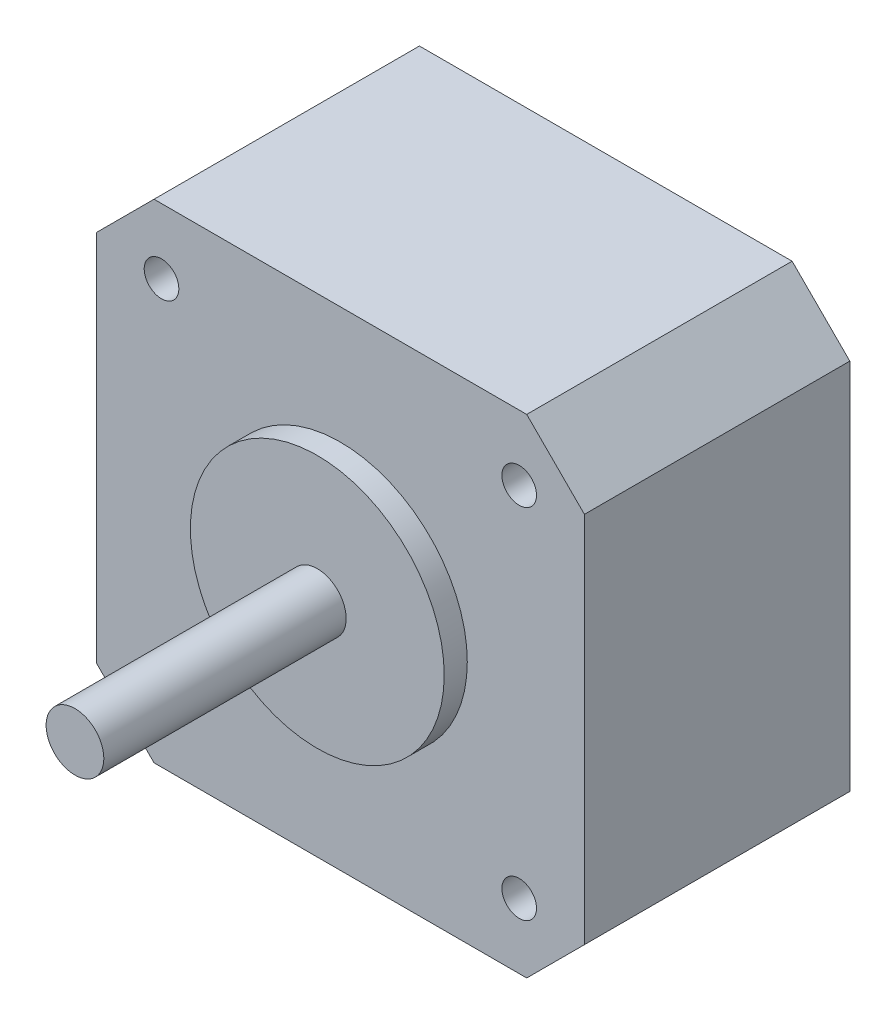
ISO-10303-21;
HEADER;
FILE_DESCRIPTION(('STEP AP214'),'2;1');
FILE_NAME('part.step','',(''),(''),'','','');
FILE_SCHEMA(('AUTOMOTIVE_DESIGN { 1 0 10303 214 1 1 1 1 }'));
ENDSEC;
DATA;
#1=APPLICATION_CONTEXT('core data for automotive mechanical design processes');
#2=APPLICATION_PROTOCOL_DEFINITION('international standard','automotive_design',2000,#1);
#3=PRODUCT_CONTEXT('',#1,'mechanical');
#4=PRODUCT('Part','Part','',(#3));
#5=PRODUCT_RELATED_PRODUCT_CATEGORY('part','',(#4));
#6=PRODUCT_DEFINITION_FORMATION('','',#4);
#7=PRODUCT_DEFINITION_CONTEXT('part definition',#1,'design');
#8=PRODUCT_DEFINITION('design','',#6,#7);
#9=PRODUCT_DEFINITION_SHAPE('','',#8);
#10=(LENGTH_UNIT() NAMED_UNIT(*) SI_UNIT(.MILLI.,.METRE.));
#11=(NAMED_UNIT(*) PLANE_ANGLE_UNIT() SI_UNIT($,.RADIAN.));
#12=(NAMED_UNIT(*) SI_UNIT($,.STERADIAN.) SOLID_ANGLE_UNIT());
#13=UNCERTAINTY_MEASURE_WITH_UNIT(LENGTH_MEASURE(1.E-05),#10,'distance_accuracy_value','');
#14=(GEOMETRIC_REPRESENTATION_CONTEXT(3) GLOBAL_UNCERTAINTY_ASSIGNED_CONTEXT((#13)) GLOBAL_UNIT_ASSIGNED_CONTEXT((#10,
#11,#12)) REPRESENTATION_CONTEXT('',''));
#15=CARTESIAN_POINT('',(0.,0.,0.));
#16=DIRECTION('',(0.,0.,1.));
#17=DIRECTION('',(1.,0.,0.));
#18=AXIS2_PLACEMENT_3D('',#15,#16,#17);
#19=CARTESIAN_POINT('',(21.15,21.15,-23.));
#20=DIRECTION('',(1.,0.,0.));
#21=DIRECTION('',(0.,0.,-1.));
#22=AXIS2_PLACEMENT_3D('',#19,#20,#21);
#23=PLANE('',#22);
#24=DIRECTION('',(0.,1.,0.));
#25=VECTOR('',#24,1.);
#26=CARTESIAN_POINT('',(21.15,21.15,0.));
#27=LINE('',#26,#25);
#28=CARTESIAN_POINT('',(21.15,-16.15,0.));
#29=VERTEX_POINT('',#28);
#30=CARTESIAN_POINT('',(21.15,16.15,0.));
#31=VERTEX_POINT('',#30);
#32=EDGE_CURVE('E210',#29,#31,#27,.T.);
#33=ORIENTED_EDGE('',*,*,#32,.F.);
#34=DIRECTION('',(0.,0.,-1.));
#35=VECTOR('',#34,1.);
#36=CARTESIAN_POINT('',(21.15,-16.15,-23.));
#37=LINE('',#36,#35);
#38=CARTESIAN_POINT('',(21.15,-16.15,-23.));
#39=VERTEX_POINT('',#38);
#40=EDGE_CURVE('E285',#29,#39,#37,.T.);
#41=ORIENTED_EDGE('',*,*,#40,.T.);
#42=DIRECTION('',(0.,1.,0.));
#43=VECTOR('',#42,1.);
#44=CARTESIAN_POINT('',(21.15,21.15,-23.));
#45=LINE('',#44,#43);
#46=CARTESIAN_POINT('',(21.15,16.15,-23.));
#47=VERTEX_POINT('',#46);
#48=EDGE_CURVE('E214',#39,#47,#45,.T.);
#49=ORIENTED_EDGE('',*,*,#48,.T.);
#50=DIRECTION('',(0.,0.,1.));
#51=VECTOR('',#50,1.);
#52=CARTESIAN_POINT('',(21.15,16.15,-23.));
#53=LINE('',#52,#51);
#54=EDGE_CURVE('E281',#47,#31,#53,.T.);
#55=ORIENTED_EDGE('',*,*,#54,.T.);
#56=EDGE_LOOP('',(#33,#41,#49,#55));
#57=FACE_BOUND('',#56,.T.);
#58=ADVANCED_FACE('F41',(#57),#23,.T.);
#59=CARTESIAN_POINT('',(-21.15,-21.15,-23.));
#60=DIRECTION('',(0.,-1.,0.));
#61=DIRECTION('',(0.,0.,-1.));
#62=AXIS2_PLACEMENT_3D('',#59,#60,#61);
#63=PLANE('',#62);
#64=DIRECTION('',(0.,0.,-1.));
#65=VECTOR('',#64,1.);
#66=CARTESIAN_POINT('',(-8.,-21.15,-13.4));
#67=LINE('',#66,#65);
#68=CARTESIAN_POINT('',(-8.,-21.15,-13.4));
#69=VERTEX_POINT('',#68);
#70=CARTESIAN_POINT('',(-8.,-21.15,-23.));
#71=VERTEX_POINT('',#70);
#72=EDGE_CURVE('E152',#69,#71,#67,.T.);
#73=ORIENTED_EDGE('',*,*,#72,.F.);
#74=DIRECTION('',(1.,0.,0.));
#75=VECTOR('',#74,1.);
#76=CARTESIAN_POINT('',(8.,-21.15,-13.4));
#77=LINE('',#76,#75);
#78=CARTESIAN_POINT('',(8.,-21.15,-13.4));
#79=VERTEX_POINT('',#78);
#80=EDGE_CURVE('E137',#69,#79,#77,.T.);
#81=ORIENTED_EDGE('',*,*,#80,.T.);
#82=DIRECTION('',(0.,0.,-1.));
#83=VECTOR('',#82,1.);
#84=CARTESIAN_POINT('',(8.,-21.15,-13.4));
#85=LINE('',#84,#83);
#86=CARTESIAN_POINT('',(7.99999999999999,-21.15,-23.));
#87=VERTEX_POINT('',#86);
#88=EDGE_CURVE('E163',#79,#87,#85,.T.);
#89=ORIENTED_EDGE('',*,*,#88,.T.);
#90=DIRECTION('',(1.,0.,0.));
#91=VECTOR('',#90,1.);
#92=CARTESIAN_POINT('',(-21.15,-21.15,-23.));
#93=LINE('',#92,#91);
#94=CARTESIAN_POINT('',(16.15,-21.15,-23.));
#95=VERTEX_POINT('',#94);
#96=EDGE_CURVE('E226',#87,#95,#93,.T.);
#97=ORIENTED_EDGE('',*,*,#96,.T.);
#98=DIRECTION('',(0.,0.,1.));
#99=VECTOR('',#98,1.);
#100=CARTESIAN_POINT('',(16.15,-21.15,-23.));
#101=LINE('',#100,#99);
#102=CARTESIAN_POINT('',(16.15,-21.15,0.));
#103=VERTEX_POINT('',#102);
#104=EDGE_CURVE('E262',#95,#103,#101,.T.);
#105=ORIENTED_EDGE('',*,*,#104,.T.);
#106=DIRECTION('',(1.,0.,0.));
#107=VECTOR('',#106,1.);
#108=CARTESIAN_POINT('',(-21.15,-21.15,0.));
#109=LINE('',#108,#107);
#110=CARTESIAN_POINT('',(-16.15,-21.15,0.));
#111=VERTEX_POINT('',#110);
#112=EDGE_CURVE('E219',#111,#103,#109,.T.);
#113=ORIENTED_EDGE('',*,*,#112,.F.);
#114=DIRECTION('',(0.,0.,-1.));
#115=VECTOR('',#114,1.);
#116=CARTESIAN_POINT('',(-16.15,-21.15,-23.));
#117=LINE('',#116,#115);
#118=CARTESIAN_POINT('',(-16.15,-21.15,-23.));
#119=VERTEX_POINT('',#118);
#120=EDGE_CURVE('E266',#111,#119,#117,.T.);
#121=ORIENTED_EDGE('',*,*,#120,.T.);
#122=EDGE_CURVE('E161',#119,#71,#93,.T.);
#123=ORIENTED_EDGE('',*,*,#122,.T.);
#124=EDGE_LOOP('',(#73,#81,#89,#97,#105,#113,#121,#123));
#125=FACE_BOUND('',#124,.T.);
#126=ADVANCED_FACE('F159',(#125),#63,.T.);
#127=CARTESIAN_POINT('',(-21.15,21.15,-23.));
#128=DIRECTION('',(-1.,0.,0.));
#129=DIRECTION('',(0.,-1.,0.));
#130=AXIS2_PLACEMENT_3D('',#127,#128,#129);
#131=PLANE('',#130);
#132=DIRECTION('',(0.,-1.,0.));
#133=VECTOR('',#132,1.);
#134=CARTESIAN_POINT('',(-21.15,21.15,-23.));
#135=LINE('',#134,#133);
#136=CARTESIAN_POINT('',(-21.15,16.15,-23.));
#137=VERTEX_POINT('',#136);
#138=CARTESIAN_POINT('',(-21.15,-16.15,-23.));
#139=VERTEX_POINT('',#138);
#140=EDGE_CURVE('E222',#137,#139,#135,.T.);
#141=ORIENTED_EDGE('',*,*,#140,.T.);
#142=DIRECTION('',(0.,0.,1.));
#143=VECTOR('',#142,1.);
#144=CARTESIAN_POINT('',(-21.15,-16.15,-23.));
#145=LINE('',#144,#143);
#146=CARTESIAN_POINT('',(-21.15,-16.15,0.));
#147=VERTEX_POINT('',#146);
#148=EDGE_CURVE('E246',#139,#147,#145,.T.);
#149=ORIENTED_EDGE('',*,*,#148,.T.);
#150=DIRECTION('',(0.,-1.,0.));
#151=VECTOR('',#150,1.);
#152=CARTESIAN_POINT('',(-21.15,21.15,0.));
#153=LINE('',#152,#151);
#154=CARTESIAN_POINT('',(-21.15,16.15,0.));
#155=VERTEX_POINT('',#154);
#156=EDGE_CURVE('E237',#155,#147,#153,.T.);
#157=ORIENTED_EDGE('',*,*,#156,.F.);
#158=DIRECTION('',(0.,0.,-1.));
#159=VECTOR('',#158,1.);
#160=CARTESIAN_POINT('',(-21.15,16.15,-23.));
#161=LINE('',#160,#159);
#162=EDGE_CURVE('E229',#155,#137,#161,.T.);
#163=ORIENTED_EDGE('',*,*,#162,.T.);
#164=EDGE_LOOP('',(#141,#149,#157,#163));
#165=FACE_BOUND('',#164,.T.);
#166=ADVANCED_FACE('F341',(#165),#131,.T.);
#167=CARTESIAN_POINT('',(-21.15,21.15,-23.));
#168=DIRECTION('',(0.,1.,0.));
#169=DIRECTION('',(0.,0.,1.));
#170=AXIS2_PLACEMENT_3D('',#167,#168,#169);
#171=PLANE('',#170);
#172=DIRECTION('',(-1.,0.,0.));
#173=VECTOR('',#172,1.);
#174=CARTESIAN_POINT('',(-21.15,21.15,0.));
#175=LINE('',#174,#173);
#176=CARTESIAN_POINT('',(16.15,21.15,0.));
#177=VERTEX_POINT('',#176);
#178=CARTESIAN_POINT('',(-16.15,21.15,0.));
#179=VERTEX_POINT('',#178);
#180=EDGE_CURVE('E233',#177,#179,#175,.T.);
#181=ORIENTED_EDGE('',*,*,#180,.F.);
#182=DIRECTION('',(0.,0.,-1.));
#183=VECTOR('',#182,1.);
#184=CARTESIAN_POINT('',(16.15,21.15,-23.));
#185=LINE('',#184,#183);
#186=CARTESIAN_POINT('',(16.15,21.15,-23.));
#187=VERTEX_POINT('',#186);
#188=EDGE_CURVE('E52',#177,#187,#185,.T.);
#189=ORIENTED_EDGE('',*,*,#188,.T.);
#190=DIRECTION('',(-1.,0.,0.));
#191=VECTOR('',#190,1.);
#192=CARTESIAN_POINT('',(-21.15,21.15,-23.));
#193=LINE('',#192,#191);
#194=CARTESIAN_POINT('',(-16.15,21.15,-23.));
#195=VERTEX_POINT('',#194);
#196=EDGE_CURVE('E218',#187,#195,#193,.T.);
#197=ORIENTED_EDGE('',*,*,#196,.T.);
#198=DIRECTION('',(0.,0.,1.));
#199=VECTOR('',#198,1.);
#200=CARTESIAN_POINT('',(-16.15,21.15,-23.));
#201=LINE('',#200,#199);
#202=EDGE_CURVE('E288',#195,#179,#201,.T.);
#203=ORIENTED_EDGE('',*,*,#202,.T.);
#204=EDGE_LOOP('',(#181,#189,#197,#203));
#205=FACE_BOUND('',#204,.T.);
#206=ADVANCED_FACE('F295',(#205),#171,.T.);
#207=CARTESIAN_POINT('',(0.,0.,-23.));
#208=DIRECTION('',(0.,0.,1.));
#209=DIRECTION('',(1.,0.,0.));
#210=AXIS2_PLACEMENT_3D('',#207,#208,#209);
#211=PLANE('',#210);
#212=ORIENTED_EDGE('',*,*,#122,.F.);
#213=DIRECTION('',(0.707106781186549,-0.707106781186547,0.));
#214=VECTOR('',#213,1.);
#215=CARTESIAN_POINT('',(-21.15,-16.15,-23.));
#216=LINE('',#215,#214);
#217=EDGE_CURVE('E278',#119,#139,#216,.F.);
#218=ORIENTED_EDGE('',*,*,#217,.T.);
#219=ORIENTED_EDGE('',*,*,#140,.F.);
#220=DIRECTION('',(-0.707106781186547,-0.707106781186549,0.));
#221=VECTOR('',#220,1.);
#222=CARTESIAN_POINT('',(-16.15,21.15,-23.));
#223=LINE('',#222,#221);
#224=EDGE_CURVE('E68',#137,#195,#223,.F.);
#225=ORIENTED_EDGE('',*,*,#224,.T.);
#226=ORIENTED_EDGE('',*,*,#196,.F.);
#227=DIRECTION('',(-0.707106781186549,0.707106781186547,0.));
#228=VECTOR('',#227,1.);
#229=CARTESIAN_POINT('',(21.15,16.15,-23.));
#230=LINE('',#229,#228);
#231=EDGE_CURVE('E271',#187,#47,#230,.F.);
#232=ORIENTED_EDGE('',*,*,#231,.T.);
#233=ORIENTED_EDGE('',*,*,#48,.F.);
#234=DIRECTION('',(0.707106781186547,0.707106781186549,0.));
#235=VECTOR('',#234,1.);
#236=CARTESIAN_POINT('',(16.15,-21.15,-23.));
#237=LINE('',#236,#235);
#238=EDGE_CURVE('E274',#39,#95,#237,.F.);
#239=ORIENTED_EDGE('',*,*,#238,.T.);
#240=ORIENTED_EDGE('',*,*,#96,.F.);
#241=DIRECTION('',(0.,-1.,0.));
#242=VECTOR('',#241,1.);
#243=CARTESIAN_POINT('',(8.,-28.15,-23.));
#244=LINE('',#243,#242);
#245=CARTESIAN_POINT('',(8.,-28.15,-23.));
#246=VERTEX_POINT('',#245);
#247=EDGE_CURVE('E60',#87,#246,#244,.T.);
#248=ORIENTED_EDGE('',*,*,#247,.T.);
#249=DIRECTION('',(-1.,0.,0.));
#250=VECTOR('',#249,1.);
#251=CARTESIAN_POINT('',(8.,-28.15,-23.));
#252=LINE('',#251,#250);
#253=CARTESIAN_POINT('',(-8.,-28.15,-23.));
#254=VERTEX_POINT('',#253);
#255=EDGE_CURVE('E156',#246,#254,#252,.T.);
#256=ORIENTED_EDGE('',*,*,#255,.T.);
#257=DIRECTION('',(0.,1.,0.));
#258=VECTOR('',#257,1.);
#259=CARTESIAN_POINT('',(-8.,-28.15,-23.));
#260=LINE('',#259,#258);
#261=EDGE_CURVE('E327',#254,#71,#260,.T.);
#262=ORIENTED_EDGE('',*,*,#261,.T.);
#263=EDGE_LOOP('',(#212,#218,#219,#225,#226,#232,#233,#239,#240,#248,#256,#262));
#264=FACE_BOUND('',#263,.T.);
#265=ADVANCED_FACE('F299',(#264),#211,.F.);
#266=CARTESIAN_POINT('',(0.,0.,0.));
#267=DIRECTION('',(0.,0.,1.));
#268=DIRECTION('',(1.,0.,0.));
#269=AXIS2_PLACEMENT_3D('',#266,#267,#268);
#270=PLANE('',#269);
#271=CARTESIAN_POINT('',(0.,0.,0.));
#272=DIRECTION('',(0.,0.,1.));
#273=DIRECTION('',(1.,0.,0.));
#274=AXIS2_PLACEMENT_3D('',#271,#272,#273);
#275=CIRCLE('',#274,11.);
#276=CARTESIAN_POINT('',(11.,0.,0.));
#277=VERTEX_POINT('',#276);
#278=EDGE_CURVE('E11',#277,#277,#275,.T.);
#279=ORIENTED_EDGE('',*,*,#278,.F.);
#280=EDGE_LOOP('',(#279));
#281=FACE_BOUND('',#280,.T.);
#282=CARTESIAN_POINT('',(15.5000000000002,15.4999999999998,0.));
#283=DIRECTION('',(0.,0.,1.));
#284=DIRECTION('',(1.,0.,0.));
#285=AXIS2_PLACEMENT_3D('',#282,#283,#284);
#286=CIRCLE('',#285,1.5);
#287=CARTESIAN_POINT('',(17.0000000000002,15.4999999999998,0.));
#288=VERTEX_POINT('',#287);
#289=EDGE_CURVE('E180',#288,#288,#286,.T.);
#290=ORIENTED_EDGE('',*,*,#289,.F.);
#291=EDGE_LOOP('',(#290));
#292=FACE_BOUND('',#291,.T.);
#293=CARTESIAN_POINT('',(-15.4999999999999,15.5000000000001,0.));
#294=DIRECTION('',(0.,0.,1.));
#295=DIRECTION('',(1.,0.,0.));
#296=AXIS2_PLACEMENT_3D('',#293,#294,#295);
#297=CIRCLE('',#296,1.5);
#298=CARTESIAN_POINT('',(-13.9999999999999,15.5000000000001,0.));
#299=VERTEX_POINT('',#298);
#300=EDGE_CURVE('E195',#299,#299,#297,.T.);
#301=ORIENTED_EDGE('',*,*,#300,.F.);
#302=EDGE_LOOP('',(#301));
#303=FACE_BOUND('',#302,.T.);
#304=CARTESIAN_POINT('',(-15.5000000000001,-15.4999999999999,0.));
#305=DIRECTION('',(0.,0.,1.));
#306=DIRECTION('',(1.,0.,0.));
#307=AXIS2_PLACEMENT_3D('',#304,#305,#306);
#308=CIRCLE('',#307,1.5);
#309=CARTESIAN_POINT('',(-14.0000000000001,-15.4999999999999,0.));
#310=VERTEX_POINT('',#309);
#311=EDGE_CURVE('E187',#310,#310,#308,.T.);
#312=ORIENTED_EDGE('',*,*,#311,.F.);
#313=EDGE_LOOP('',(#312));
#314=FACE_BOUND('',#313,.T.);
#315=CARTESIAN_POINT('',(15.5,-15.5,0.));
#316=DIRECTION('',(0.,0.,1.));
#317=DIRECTION('',(1.,0.,0.));
#318=AXIS2_PLACEMENT_3D('',#315,#316,#317);
#319=CIRCLE('',#318,1.5);
#320=CARTESIAN_POINT('',(17.,-15.5,0.));
#321=VERTEX_POINT('',#320);
#322=EDGE_CURVE('E186',#321,#321,#319,.T.);
#323=ORIENTED_EDGE('',*,*,#322,.F.);
#324=EDGE_LOOP('',(#323));
#325=FACE_BOUND('',#324,.T.);
#326=ORIENTED_EDGE('',*,*,#156,.T.);
#327=DIRECTION('',(-0.707106781186549,0.707106781186547,0.));
#328=VECTOR('',#327,1.);
#329=CARTESIAN_POINT('',(-18.65,-18.65,0.));
#330=LINE('',#329,#328);
#331=EDGE_CURVE('E259',#147,#111,#330,.F.);
#332=ORIENTED_EDGE('',*,*,#331,.T.);
#333=ORIENTED_EDGE('',*,*,#112,.T.);
#334=DIRECTION('',(-0.707106781186547,-0.707106781186549,0.));
#335=VECTOR('',#334,1.);
#336=CARTESIAN_POINT('',(18.65,-18.65,0.));
#337=LINE('',#336,#335);
#338=EDGE_CURVE('E256',#103,#29,#337,.F.);
#339=ORIENTED_EDGE('',*,*,#338,.T.);
#340=ORIENTED_EDGE('',*,*,#32,.T.);
#341=DIRECTION('',(0.707106781186549,-0.707106781186547,0.));
#342=VECTOR('',#341,1.);
#343=CARTESIAN_POINT('',(18.65,18.65,0.));
#344=LINE('',#343,#342);
#345=EDGE_CURVE('E253',#31,#177,#344,.F.);
#346=ORIENTED_EDGE('',*,*,#345,.T.);
#347=ORIENTED_EDGE('',*,*,#180,.T.);
#348=DIRECTION('',(0.707106781186547,0.707106781186549,0.));
#349=VECTOR('',#348,1.);
#350=CARTESIAN_POINT('',(-18.65,18.65,0.));
#351=LINE('',#350,#349);
#352=EDGE_CURVE('E250',#179,#155,#351,.F.);
#353=ORIENTED_EDGE('',*,*,#352,.T.);
#354=EDGE_LOOP('',(#326,#332,#333,#339,#340,#346,#347,#353));
#355=FACE_BOUND('',#354,.T.);
#356=ADVANCED_FACE('F307',(#281,#292,#303,#314,#325,#355),#270,.T.);
#357=CARTESIAN_POINT('',(-21.15,-16.15,-23.));
#358=DIRECTION('',(0.707106781186547,0.707106781186549,0.));
#359=DIRECTION('',(0.,0.,1.));
#360=AXIS2_PLACEMENT_3D('',#357,#358,#359);
#361=PLANE('',#360);
#362=ORIENTED_EDGE('',*,*,#217,.F.);
#363=ORIENTED_EDGE('',*,*,#120,.F.);
#364=ORIENTED_EDGE('',*,*,#331,.F.);
#365=ORIENTED_EDGE('',*,*,#148,.F.);
#366=EDGE_LOOP('',(#362,#363,#364,#365));
#367=FACE_BOUND('',#366,.T.);
#368=ADVANCED_FACE('F338',(#367),#361,.F.);
#369=CARTESIAN_POINT('',(16.15,-21.15,-23.));
#370=DIRECTION('',(-0.707106781186549,0.707106781186547,0.));
#371=DIRECTION('',(0.,0.,1.));
#372=AXIS2_PLACEMENT_3D('',#369,#370,#371);
#373=PLANE('',#372);
#374=ORIENTED_EDGE('',*,*,#238,.F.);
#375=ORIENTED_EDGE('',*,*,#40,.F.);
#376=ORIENTED_EDGE('',*,*,#338,.F.);
#377=ORIENTED_EDGE('',*,*,#104,.F.);
#378=EDGE_LOOP('',(#374,#375,#376,#377));
#379=FACE_BOUND('',#378,.T.);
#380=ADVANCED_FACE('F312',(#379),#373,.F.);
#381=CARTESIAN_POINT('',(21.15,16.15,-23.));
#382=DIRECTION('',(-0.707106781186547,-0.707106781186549,0.));
#383=DIRECTION('',(0.,0.,1.));
#384=AXIS2_PLACEMENT_3D('',#381,#382,#383);
#385=PLANE('',#384);
#386=ORIENTED_EDGE('',*,*,#231,.F.);
#387=ORIENTED_EDGE('',*,*,#188,.F.);
#388=ORIENTED_EDGE('',*,*,#345,.F.);
#389=ORIENTED_EDGE('',*,*,#54,.F.);
#390=EDGE_LOOP('',(#386,#387,#388,#389));
#391=FACE_BOUND('',#390,.T.);
#392=ADVANCED_FACE('F302',(#391),#385,.F.);
#393=CARTESIAN_POINT('',(-16.15,21.15,-23.));
#394=DIRECTION('',(0.707106781186549,-0.707106781186547,0.));
#395=DIRECTION('',(0.,0.,1.));
#396=AXIS2_PLACEMENT_3D('',#393,#394,#395);
#397=PLANE('',#396);
#398=ORIENTED_EDGE('',*,*,#224,.F.);
#399=ORIENTED_EDGE('',*,*,#162,.F.);
#400=ORIENTED_EDGE('',*,*,#352,.F.);
#401=ORIENTED_EDGE('',*,*,#202,.F.);
#402=EDGE_LOOP('',(#398,#399,#400,#401));
#403=FACE_BOUND('',#402,.T.);
#404=ADVANCED_FACE('F44',(#403),#397,.F.);
#405=CARTESIAN_POINT('',(15.5,-15.5,-5.));
#406=DIRECTION('',(0.,0.,1.));
#407=DIRECTION('',(1.,0.,0.));
#408=AXIS2_PLACEMENT_3D('',#405,#406,#407);
#409=CYLINDRICAL_SURFACE('',#408,1.5);
#410=CARTESIAN_POINT('',(15.5,-15.5,-5.));
#411=DIRECTION('',(0.,0.,1.));
#412=DIRECTION('',(1.,0.,0.));
#413=AXIS2_PLACEMENT_3D('',#410,#411,#412);
#414=CIRCLE('',#413,1.5);
#415=CARTESIAN_POINT('',(17.,-15.5,-5.));
#416=VERTEX_POINT('',#415);
#417=EDGE_CURVE('E206',#416,#416,#414,.T.);
#418=ORIENTED_EDGE('',*,*,#417,.F.);
#419=EDGE_LOOP('',(#418));
#420=FACE_BOUND('',#419,.T.);
#421=ORIENTED_EDGE('',*,*,#322,.T.);
#422=EDGE_LOOP('',(#421));
#423=FACE_BOUND('',#422,.T.);
#424=ADVANCED_FACE('F345',(#420,#423),#409,.F.);
#425=CARTESIAN_POINT('',(15.5,-15.5,-5.));
#426=DIRECTION('',(0.,0.,1.));
#427=DIRECTION('',(1.,0.,0.));
#428=AXIS2_PLACEMENT_3D('',#425,#426,#427);
#429=PLANE('',#428);
#430=ORIENTED_EDGE('',*,*,#417,.T.);
#431=EDGE_LOOP('',(#430));
#432=FACE_BOUND('',#431,.T.);
#433=ADVANCED_FACE('F350',(#432),#429,.T.);
#434=CARTESIAN_POINT('',(-15.5000000000001,-15.4999999999999,-5.));
#435=DIRECTION('',(0.,0.,1.));
#436=DIRECTION('',(1.,0.,0.));
#437=AXIS2_PLACEMENT_3D('',#434,#435,#436);
#438=CYLINDRICAL_SURFACE('',#437,1.5);
#439=CARTESIAN_POINT('',(-15.5000000000001,-15.4999999999999,-5.));
#440=DIRECTION('',(0.,0.,1.));
#441=DIRECTION('',(1.,0.,0.));
#442=AXIS2_PLACEMENT_3D('',#439,#440,#441);
#443=CIRCLE('',#442,1.5);
#444=CARTESIAN_POINT('',(-14.0000000000001,-15.4999999999999,-5.));
#445=VERTEX_POINT('',#444);
#446=EDGE_CURVE('E182',#445,#445,#443,.T.);
#447=ORIENTED_EDGE('',*,*,#446,.F.);
#448=EDGE_LOOP('',(#447));
#449=FACE_BOUND('',#448,.T.);
#450=ORIENTED_EDGE('',*,*,#311,.T.);
#451=EDGE_LOOP('',(#450));
#452=FACE_BOUND('',#451,.T.);
#453=ADVANCED_FACE('F404',(#449,#452),#438,.F.);
#454=CARTESIAN_POINT('',(-15.5000000000001,-15.4999999999999,-5.));
#455=DIRECTION('',(0.,0.,1.));
#456=DIRECTION('',(1.,0.,0.));
#457=AXIS2_PLACEMENT_3D('',#454,#455,#456);
#458=PLANE('',#457);
#459=ORIENTED_EDGE('',*,*,#446,.T.);
#460=EDGE_LOOP('',(#459));
#461=FACE_BOUND('',#460,.T.);
#462=ADVANCED_FACE('F414',(#461),#458,.T.);
#463=CARTESIAN_POINT('',(-15.4999999999999,15.5000000000001,-5.));
#464=DIRECTION('',(0.,0.,1.));
#465=DIRECTION('',(1.,0.,0.));
#466=AXIS2_PLACEMENT_3D('',#463,#464,#465);
#467=CYLINDRICAL_SURFACE('',#466,1.5);
#468=CARTESIAN_POINT('',(-15.4999999999999,15.5000000000001,-5.));
#469=DIRECTION('',(0.,0.,1.));
#470=DIRECTION('',(1.,0.,0.));
#471=AXIS2_PLACEMENT_3D('',#468,#469,#470);
#472=CIRCLE('',#471,1.5);
#473=CARTESIAN_POINT('',(-13.9999999999999,15.5000000000001,-5.));
#474=VERTEX_POINT('',#473);
#475=EDGE_CURVE('E191',#474,#474,#472,.T.);
#476=ORIENTED_EDGE('',*,*,#475,.F.);
#477=EDGE_LOOP('',(#476));
#478=FACE_BOUND('',#477,.T.);
#479=ORIENTED_EDGE('',*,*,#300,.T.);
#480=EDGE_LOOP('',(#479));
#481=FACE_BOUND('',#480,.T.);
#482=ADVANCED_FACE('F424',(#478,#481),#467,.F.);
#483=CARTESIAN_POINT('',(-15.4999999999999,15.5000000000001,-5.));
#484=DIRECTION('',(0.,0.,1.));
#485=DIRECTION('',(1.,0.,0.));
#486=AXIS2_PLACEMENT_3D('',#483,#484,#485);
#487=PLANE('',#486);
#488=ORIENTED_EDGE('',*,*,#475,.T.);
#489=EDGE_LOOP('',(#488));
#490=FACE_BOUND('',#489,.T.);
#491=ADVANCED_FACE('F434',(#490),#487,.T.);
#492=CARTESIAN_POINT('',(15.5000000000002,15.4999999999998,-5.));
#493=DIRECTION('',(0.,0.,1.));
#494=DIRECTION('',(1.,0.,0.));
#495=AXIS2_PLACEMENT_3D('',#492,#493,#494);
#496=CYLINDRICAL_SURFACE('',#495,1.5);
#497=CARTESIAN_POINT('',(15.5000000000002,15.4999999999998,-5.));
#498=DIRECTION('',(0.,0.,1.));
#499=DIRECTION('',(1.,0.,0.));
#500=AXIS2_PLACEMENT_3D('',#497,#498,#499);
#501=CIRCLE('',#500,1.5);
#502=CARTESIAN_POINT('',(17.0000000000002,15.4999999999998,-5.));
#503=VERTEX_POINT('',#502);
#504=EDGE_CURVE('E199',#503,#503,#501,.T.);
#505=ORIENTED_EDGE('',*,*,#504,.F.);
#506=EDGE_LOOP('',(#505));
#507=FACE_BOUND('',#506,.T.);
#508=ORIENTED_EDGE('',*,*,#289,.T.);
#509=EDGE_LOOP('',(#508));
#510=FACE_BOUND('',#509,.T.);
#511=ADVANCED_FACE('F444',(#507,#510),#496,.F.);
#512=CARTESIAN_POINT('',(15.5000000000002,15.4999999999998,-5.));
#513=DIRECTION('',(0.,0.,1.));
#514=DIRECTION('',(1.,0.,0.));
#515=AXIS2_PLACEMENT_3D('',#512,#513,#514);
#516=PLANE('',#515);
#517=ORIENTED_EDGE('',*,*,#504,.T.);
#518=EDGE_LOOP('',(#517));
#519=FACE_BOUND('',#518,.T.);
#520=ADVANCED_FACE('F454',(#519),#516,.T.);
#521=CARTESIAN_POINT('',(0.,0.,2.));
#522=DIRECTION('',(0.,0.,-1.));
#523=DIRECTION('',(-1.,0.,0.));
#524=AXIS2_PLACEMENT_3D('',#521,#522,#523);
#525=CYLINDRICAL_SURFACE('',#524,11.);
#526=CARTESIAN_POINT('',(0.,0.,2.));
#527=DIRECTION('',(0.,0.,1.));
#528=DIRECTION('',(1.,0.,0.));
#529=AXIS2_PLACEMENT_3D('',#526,#527,#528);
#530=CIRCLE('',#529,11.);
#531=CARTESIAN_POINT('',(11.,0.,2.));
#532=VERTEX_POINT('',#531);
#533=EDGE_CURVE('E177',#532,#532,#530,.T.);
#534=ORIENTED_EDGE('',*,*,#533,.F.);
#535=EDGE_LOOP('',(#534));
#536=FACE_BOUND('',#535,.T.);
#537=ORIENTED_EDGE('',*,*,#278,.T.);
#538=EDGE_LOOP('',(#537));
#539=FACE_BOUND('',#538,.T.);
#540=ADVANCED_FACE('F464',(#536,#539),#525,.T.);
#541=CARTESIAN_POINT('',(0.,0.,2.));
#542=DIRECTION('',(0.,0.,1.));
#543=DIRECTION('',(1.,0.,0.));
#544=AXIS2_PLACEMENT_3D('',#541,#542,#543);
#545=PLANE('',#544);
#546=CARTESIAN_POINT('',(0.,0.,2.));
#547=DIRECTION('',(0.,0.,1.));
#548=DIRECTION('',(1.,0.,0.));
#549=AXIS2_PLACEMENT_3D('',#546,#547,#548);
#550=CIRCLE('',#549,2.5);
#551=CARTESIAN_POINT('',(2.5,0.,2.));
#552=VERTEX_POINT('',#551);
#553=EDGE_CURVE('E46',#552,#552,#550,.F.);
#554=ORIENTED_EDGE('',*,*,#553,.T.);
#555=EDGE_LOOP('',(#554));
#556=FACE_BOUND('',#555,.T.);
#557=ORIENTED_EDGE('',*,*,#533,.T.);
#558=EDGE_LOOP('',(#557));
#559=FACE_BOUND('',#558,.T.);
#560=ADVANCED_FACE('F485',(#556,#559),#545,.T.);
#561=CARTESIAN_POINT('',(0.,0.,23.));
#562=DIRECTION('',(0.,0.,-1.));
#563=DIRECTION('',(-1.,0.,0.));
#564=AXIS2_PLACEMENT_3D('',#561,#562,#563);
#565=CYLINDRICAL_SURFACE('',#564,2.5);
#566=ORIENTED_EDGE('',*,*,#553,.F.);
#567=EDGE_LOOP('',(#566));
#568=FACE_BOUND('',#567,.T.);
#569=CARTESIAN_POINT('',(0.,0.,23.));
#570=DIRECTION('',(0.,0.,1.));
#571=DIRECTION('',(1.,0.,0.));
#572=AXIS2_PLACEMENT_3D('',#569,#570,#571);
#573=CIRCLE('',#572,2.5);
#574=CARTESIAN_POINT('',(2.5,0.,23.));
#575=VERTEX_POINT('',#574);
#576=EDGE_CURVE('E173',#575,#575,#573,.T.);
#577=ORIENTED_EDGE('',*,*,#576,.F.);
#578=EDGE_LOOP('',(#577));
#579=FACE_BOUND('',#578,.T.);
#580=ADVANCED_FACE('F495',(#568,#579),#565,.T.);
#581=CARTESIAN_POINT('',(0.,0.,23.));
#582=DIRECTION('',(0.,0.,1.));
#583=DIRECTION('',(1.,0.,0.));
#584=AXIS2_PLACEMENT_3D('',#581,#582,#583);
#585=PLANE('',#584);
#586=ORIENTED_EDGE('',*,*,#576,.T.);
#587=EDGE_LOOP('',(#586));
#588=FACE_BOUND('',#587,.T.);
#589=ADVANCED_FACE('F505',(#588),#585,.T.);
#590=CARTESIAN_POINT('',(-8.,-28.15,-13.4));
#591=DIRECTION('',(-1.,0.,0.));
#592=DIRECTION('',(0.,0.,1.));
#593=AXIS2_PLACEMENT_3D('',#590,#591,#592);
#594=PLANE('',#593);
#595=ORIENTED_EDGE('',*,*,#261,.F.);
#596=DIRECTION('',(0.,0.,-1.));
#597=VECTOR('',#596,1.);
#598=CARTESIAN_POINT('',(-8.,-28.15,-13.4));
#599=LINE('',#598,#597);
#600=CARTESIAN_POINT('',(-8.,-28.15,-13.4));
#601=VERTEX_POINT('',#600);
#602=EDGE_CURVE('E154',#601,#254,#599,.T.);
#603=ORIENTED_EDGE('',*,*,#602,.F.);
#604=DIRECTION('',(0.,1.,0.));
#605=VECTOR('',#604,1.);
#606=CARTESIAN_POINT('',(-8.,-28.15,-13.4));
#607=LINE('',#606,#605);
#608=EDGE_CURVE('E141',#601,#69,#607,.T.);
#609=ORIENTED_EDGE('',*,*,#608,.T.);
#610=ORIENTED_EDGE('',*,*,#72,.T.);
#611=EDGE_LOOP('',(#595,#603,#609,#610));
#612=FACE_BOUND('',#611,.T.);
#613=ADVANCED_FACE('F151',(#612),#594,.T.);
#614=CARTESIAN_POINT('',(8.,-28.15,-13.4));
#615=DIRECTION('',(0.,-1.,0.));
#616=DIRECTION('',(0.,0.,-1.));
#617=AXIS2_PLACEMENT_3D('',#614,#615,#616);
#618=PLANE('',#617);
#619=ORIENTED_EDGE('',*,*,#255,.F.);
#620=DIRECTION('',(0.,0.,-1.));
#621=VECTOR('',#620,1.);
#622=CARTESIAN_POINT('',(8.,-28.15,-13.4));
#623=LINE('',#622,#621);
#624=CARTESIAN_POINT('',(8.,-28.15,-13.4));
#625=VERTEX_POINT('',#624);
#626=EDGE_CURVE('E168',#625,#246,#623,.T.);
#627=ORIENTED_EDGE('',*,*,#626,.F.);
#628=DIRECTION('',(-1.,0.,0.));
#629=VECTOR('',#628,1.);
#630=CARTESIAN_POINT('',(8.,-28.15,-13.4));
#631=LINE('',#630,#629);
#632=EDGE_CURVE('E164',#625,#601,#631,.T.);
#633=ORIENTED_EDGE('',*,*,#632,.T.);
#634=ORIENTED_EDGE('',*,*,#602,.T.);
#635=EDGE_LOOP('',(#619,#627,#633,#634));
#636=FACE_BOUND('',#635,.T.);
#637=ADVANCED_FACE('F334',(#636),#618,.T.);
#638=CARTESIAN_POINT('',(8.,-28.15,-13.4));
#639=DIRECTION('',(1.,0.,0.));
#640=DIRECTION('',(0.,0.,-1.));
#641=AXIS2_PLACEMENT_3D('',#638,#639,#640);
#642=PLANE('',#641);
#643=ORIENTED_EDGE('',*,*,#247,.F.);
#644=ORIENTED_EDGE('',*,*,#88,.F.);
#645=DIRECTION('',(0.,-1.,0.));
#646=VECTOR('',#645,1.);
#647=CARTESIAN_POINT('',(8.,-28.15,-13.4));
#648=LINE('',#647,#646);
#649=EDGE_CURVE('E144',#79,#625,#648,.T.);
#650=ORIENTED_EDGE('',*,*,#649,.T.);
#651=ORIENTED_EDGE('',*,*,#626,.T.);
#652=EDGE_LOOP('',(#643,#644,#650,#651));
#653=FACE_BOUND('',#652,.T.);
#654=ADVANCED_FACE('F331',(#653),#642,.T.);
#655=CARTESIAN_POINT('',(0.,0.,-13.4));
#656=DIRECTION('',(0.,0.,1.));
#657=DIRECTION('',(1.,0.,0.));
#658=AXIS2_PLACEMENT_3D('',#655,#656,#657);
#659=PLANE('',#658);
#660=ORIENTED_EDGE('',*,*,#608,.F.);
#661=ORIENTED_EDGE('',*,*,#632,.F.);
#662=ORIENTED_EDGE('',*,*,#649,.F.);
#663=ORIENTED_EDGE('',*,*,#80,.F.);
#664=EDGE_LOOP('',(#660,#661,#662,#663));
#665=FACE_BOUND('',#664,.T.);
#666=ADVANCED_FACE('F139',(#665),#659,.T.);
#667=CLOSED_SHELL('',(#58,#126,#166,#206,#265,#356,#368,#380,#392,#404,#424,#433,#453,#462,#482,
#491,#511,#520,#540,#560,#580,#589,#613,#637,#654,#666));
#668=MANIFOLD_SOLID_BREP('B2',#667);
#669=ADVANCED_BREP_SHAPE_REPRESENTATION('',(#18,#668),#14);
#670=SHAPE_DEFINITION_REPRESENTATION(#9,#669);
ENDSEC;
END-ISO-10303-21;
